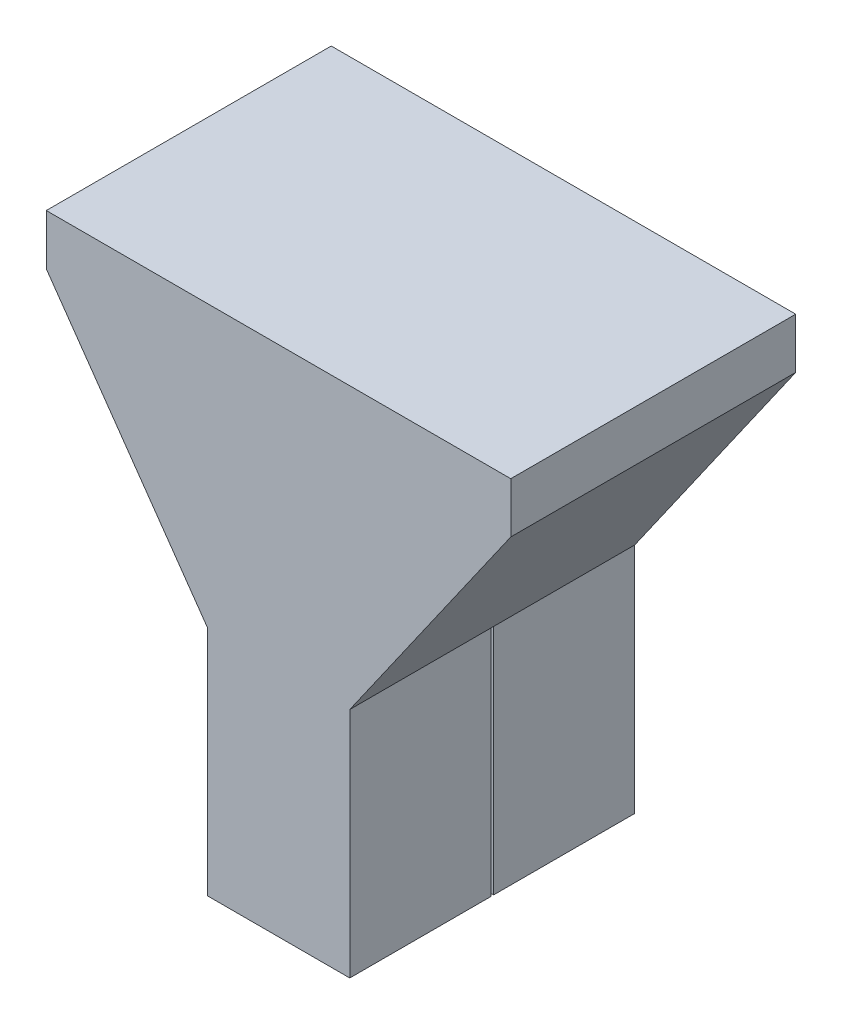
ISO-10303-21;
HEADER;
FILE_DESCRIPTION(('STEP AP214'),'2;1');
FILE_NAME('part.step','',(''),(''),'','','');
FILE_SCHEMA(('AUTOMOTIVE_DESIGN { 1 0 10303 214 1 1 1 1 }'));
ENDSEC;
DATA;
#1=APPLICATION_CONTEXT('core data for automotive mechanical design processes');
#2=APPLICATION_PROTOCOL_DEFINITION('international standard','automotive_design',2000,#1);
#3=PRODUCT_CONTEXT('',#1,'mechanical');
#4=PRODUCT('Part','Part','',(#3));
#5=PRODUCT_RELATED_PRODUCT_CATEGORY('part','',(#4));
#6=PRODUCT_DEFINITION_FORMATION('','',#4);
#7=PRODUCT_DEFINITION_CONTEXT('part definition',#1,'design');
#8=PRODUCT_DEFINITION('design','',#6,#7);
#9=PRODUCT_DEFINITION_SHAPE('','',#8);
#10=(LENGTH_UNIT() NAMED_UNIT(*) SI_UNIT(.MILLI.,.METRE.));
#11=(NAMED_UNIT(*) PLANE_ANGLE_UNIT() SI_UNIT($,.RADIAN.));
#12=(NAMED_UNIT(*) SI_UNIT($,.STERADIAN.) SOLID_ANGLE_UNIT());
#13=UNCERTAINTY_MEASURE_WITH_UNIT(LENGTH_MEASURE(1.E-05),#10,'distance_accuracy_value','');
#14=(GEOMETRIC_REPRESENTATION_CONTEXT(3) GLOBAL_UNCERTAINTY_ASSIGNED_CONTEXT((#13)) GLOBAL_UNIT_ASSIGNED_CONTEXT((#10,
#11,#12)) REPRESENTATION_CONTEXT('',''));
#15=CARTESIAN_POINT('',(0.,0.,0.));
#16=DIRECTION('',(0.,0.,1.));
#17=DIRECTION('',(1.,0.,0.));
#18=AXIS2_PLACEMENT_3D('',#15,#16,#17);
#19=CARTESIAN_POINT('',(0.,250.,-25.));
#20=DIRECTION('',(0.,0.,-1.));
#21=DIRECTION('',(-1.,0.,0.));
#22=AXIS2_PLACEMENT_3D('',#19,#20,#21);
#23=PLANE('',#22);
#24=CARTESIAN_POINT('',(0.,250.,-25.));
#25=DIRECTION('',(0.,0.,-1.));
#26=DIRECTION('',(-1.,0.,0.));
#27=AXIS2_PLACEMENT_3D('',#24,#25,#26);
#28=CIRCLE('',#27,25.);
#29=CARTESIAN_POINT('',(-25.,250.,-25.));
#30=VERTEX_POINT('',#29);
#31=EDGE_CURVE('E173',#30,#30,#28,.T.);
#32=ORIENTED_EDGE('',*,*,#31,.T.);
#33=EDGE_LOOP('',(#32));
#34=FACE_BOUND('',#33,.T.);
#35=DIRECTION('',(1.,0.,0.));
#36=VECTOR('',#35,1.);
#37=CARTESIAN_POINT('',(17.5,267.5,-25.));
#38=LINE('',#37,#36);
#39=CARTESIAN_POINT('',(-17.5,267.5,-25.));
#40=VERTEX_POINT('',#39);
#41=CARTESIAN_POINT('',(17.5,267.5,-25.));
#42=VERTEX_POINT('',#41);
#43=EDGE_CURVE('E277',#40,#42,#38,.T.);
#44=ORIENTED_EDGE('',*,*,#43,.F.);
#45=DIRECTION('',(0.,1.,0.));
#46=VECTOR('',#45,1.);
#47=CARTESIAN_POINT('',(-17.5,232.5,-25.));
#48=LINE('',#47,#46);
#49=CARTESIAN_POINT('',(-17.5,232.5,-25.));
#50=VERTEX_POINT('',#49);
#51=EDGE_CURVE('E171',#50,#40,#48,.T.);
#52=ORIENTED_EDGE('',*,*,#51,.F.);
#53=DIRECTION('',(-1.,0.,0.));
#54=VECTOR('',#53,1.);
#55=CARTESIAN_POINT('',(17.5,232.5,-25.));
#56=LINE('',#55,#54);
#57=CARTESIAN_POINT('',(17.5,232.5,-25.));
#58=VERTEX_POINT('',#57);
#59=EDGE_CURVE('E167',#58,#50,#56,.T.);
#60=ORIENTED_EDGE('',*,*,#59,.F.);
#61=DIRECTION('',(0.,-1.,0.));
#62=VECTOR('',#61,1.);
#63=CARTESIAN_POINT('',(17.5,232.5,-25.));
#64=LINE('',#63,#62);
#65=EDGE_CURVE('E279',#42,#58,#64,.T.);
#66=ORIENTED_EDGE('',*,*,#65,.F.);
#67=EDGE_LOOP('',(#44,#52,#60,#66));
#68=FACE_BOUND('',#67,.T.);
#69=ADVANCED_FACE('F33',(#34,#68),#23,.T.);
#70=CARTESIAN_POINT('',(125.,0.,500.));
#71=DIRECTION('',(-1.,0.,0.));
#72=DIRECTION('',(0.,0.,1.));
#73=AXIS2_PLACEMENT_3D('',#70,#71,#72);
#74=PLANE('',#73);
#75=DIRECTION('',(0.,-1.,0.));
#76=VECTOR('',#75,1.);
#77=CARTESIAN_POINT('',(125.,408.,252.5));
#78=LINE('',#77,#76);
#79=CARTESIAN_POINT('',(125.,408.,252.5));
#80=VERTEX_POINT('',#79);
#81=CARTESIAN_POINT('',(125.,0.,252.5));
#82=VERTEX_POINT('',#81);
#83=EDGE_CURVE('E176',#80,#82,#78,.T.);
#84=ORIENTED_EDGE('',*,*,#83,.F.);
#85=DIRECTION('',(0.,0.,-1.));
#86=VECTOR('',#85,1.);
#87=CARTESIAN_POINT('',(125.,408.,500.));
#88=LINE('',#87,#86);
#89=CARTESIAN_POINT('',(125.,408.,500.));
#90=VERTEX_POINT('',#89);
#91=EDGE_CURVE('E560',#90,#80,#88,.T.);
#92=ORIENTED_EDGE('',*,*,#91,.F.);
#93=DIRECTION('',(0.,1.,0.));
#94=VECTOR('',#93,1.);
#95=CARTESIAN_POINT('',(125.,0.,500.));
#96=LINE('',#95,#94);
#97=CARTESIAN_POINT('',(125.,0.,500.));
#98=VERTEX_POINT('',#97);
#99=EDGE_CURVE('E539',#98,#90,#96,.T.);
#100=ORIENTED_EDGE('',*,*,#99,.F.);
#101=DIRECTION('',(0.,0.,-1.));
#102=VECTOR('',#101,1.);
#103=CARTESIAN_POINT('',(125.,0.,500.));
#104=LINE('',#103,#102);
#105=EDGE_CURVE('E37',#98,#82,#104,.T.);
#106=ORIENTED_EDGE('',*,*,#105,.T.);
#107=EDGE_LOOP('',(#84,#92,#100,#106));
#108=FACE_BOUND('',#107,.T.);
#109=ADVANCED_FACE('F262',(#108),#74,.F.);
#110=CARTESIAN_POINT('',(0.,0.,500.));
#111=DIRECTION('',(0.,1.,0.));
#112=DIRECTION('',(0.,0.,1.));
#113=AXIS2_PLACEMENT_3D('',#110,#111,#112);
#114=PLANE('',#113);
#115=CARTESIAN_POINT('',(0.,0.,375.));
#116=DIRECTION('',(0.,-1.,0.));
#117=DIRECTION('',(0.,0.,-1.));
#118=AXIS2_PLACEMENT_3D('',#115,#116,#117);
#119=CIRCLE('',#118,15.);
#120=CARTESIAN_POINT('',(0.,0.,360.));
#121=VERTEX_POINT('',#120);
#122=EDGE_CURVE('E605',#121,#121,#119,.T.);
#123=ORIENTED_EDGE('',*,*,#122,.F.);
#124=EDGE_LOOP('',(#123));
#125=FACE_BOUND('',#124,.T.);
#126=CARTESIAN_POINT('',(0.,0.,125.));
#127=DIRECTION('',(0.,-1.,0.));
#128=DIRECTION('',(0.,0.,-1.));
#129=AXIS2_PLACEMENT_3D('',#126,#127,#128);
#130=CIRCLE('',#129,15.);
#131=CARTESIAN_POINT('',(0.,0.,110.));
#132=VERTEX_POINT('',#131);
#133=EDGE_CURVE('E530',#132,#132,#130,.T.);
#134=ORIENTED_EDGE('',*,*,#133,.F.);
#135=EDGE_LOOP('',(#134));
#136=FACE_BOUND('',#135,.T.);
#137=CARTESIAN_POINT('',(125.,0.,247.5));
#138=VERTEX_POINT('',#137);
#139=CARTESIAN_POINT('',(125.,0.,0.));
#140=VERTEX_POINT('',#139);
#141=EDGE_CURVE('E562',#138,#140,#104,.T.);
#142=ORIENTED_EDGE('',*,*,#141,.F.);
#143=DIRECTION('',(-1.,0.,0.));
#144=VECTOR('',#143,1.);
#145=CARTESIAN_POINT('',(125.,0.,247.5));
#146=LINE('',#145,#144);
#147=CARTESIAN_POINT('',(-95.,0.,247.5));
#148=VERTEX_POINT('',#147);
#149=EDGE_CURVE('E592',#138,#148,#146,.T.);
#150=ORIENTED_EDGE('',*,*,#149,.T.);
#151=DIRECTION('',(0.,0.,1.));
#152=VECTOR('',#151,1.);
#153=CARTESIAN_POINT('',(-95.,0.,247.5));
#154=LINE('',#153,#152);
#155=CARTESIAN_POINT('',(-95.,0.,252.5));
#156=VERTEX_POINT('',#155);
#157=EDGE_CURVE('E602',#148,#156,#154,.T.);
#158=ORIENTED_EDGE('',*,*,#157,.T.);
#159=DIRECTION('',(-1.,0.,0.));
#160=VECTOR('',#159,1.);
#161=CARTESIAN_POINT('',(125.,0.,252.5));
#162=LINE('',#161,#160);
#163=EDGE_CURVE('E583',#82,#156,#162,.T.);
#164=ORIENTED_EDGE('',*,*,#163,.F.);
#165=ORIENTED_EDGE('',*,*,#105,.F.);
#166=DIRECTION('',(1.,0.,0.));
#167=VECTOR('',#166,1.);
#168=CARTESIAN_POINT('',(0.,0.,500.));
#169=LINE('',#168,#167);
#170=CARTESIAN_POINT('',(-125.,0.,500.));
#171=VERTEX_POINT('',#170);
#172=EDGE_CURVE('E507',#171,#98,#169,.T.);
#173=ORIENTED_EDGE('',*,*,#172,.F.);
#174=DIRECTION('',(0.,0.,-1.));
#175=VECTOR('',#174,1.);
#176=CARTESIAN_POINT('',(-125.,0.,500.));
#177=LINE('',#176,#175);
#178=CARTESIAN_POINT('',(-125.,0.,0.));
#179=VERTEX_POINT('',#178);
#180=EDGE_CURVE('E504',#171,#179,#177,.T.);
#181=ORIENTED_EDGE('',*,*,#180,.T.);
#182=DIRECTION('',(1.,0.,0.));
#183=VECTOR('',#182,1.);
#184=CARTESIAN_POINT('',(0.,0.,0.));
#185=LINE('',#184,#183);
#186=EDGE_CURVE('E491',#179,#140,#185,.T.);
#187=ORIENTED_EDGE('',*,*,#186,.T.);
#188=EDGE_LOOP('',(#142,#150,#158,#164,#165,#173,#181,#187));
#189=FACE_BOUND('',#188,.T.);
#190=ADVANCED_FACE('F35',(#125,#136,#189),#114,.F.);
#191=CARTESIAN_POINT('',(125.,408.,247.5));
#192=VERTEX_POINT('',#191);
#193=CARTESIAN_POINT('',(125.,408.,0.));
#194=VERTEX_POINT('',#193);
#195=EDGE_CURVE('E559',#192,#194,#88,.T.);
#196=ORIENTED_EDGE('',*,*,#195,.F.);
#197=DIRECTION('',(0.,-1.,0.));
#198=VECTOR('',#197,1.);
#199=CARTESIAN_POINT('',(125.,408.,247.5));
#200=LINE('',#199,#198);
#201=EDGE_CURVE('E57',#192,#138,#200,.T.);
#202=ORIENTED_EDGE('',*,*,#201,.T.);
#203=ORIENTED_EDGE('',*,*,#141,.T.);
#204=DIRECTION('',(0.,1.,0.));
#205=VECTOR('',#204,1.);
#206=CARTESIAN_POINT('',(125.,0.,0.));
#207=LINE('',#206,#205);
#208=EDGE_CURVE('E498',#140,#194,#207,.T.);
#209=ORIENTED_EDGE('',*,*,#208,.T.);
#210=EDGE_LOOP('',(#196,#202,#203,#209));
#211=FACE_BOUND('',#210,.T.);
#212=ADVANCED_FACE('F258',(#211),#74,.F.);
#213=CARTESIAN_POINT('',(125.,408.,500.));
#214=DIRECTION('',(-0.819152044288993,0.573576436351044,0.));
#215=DIRECTION('',(-0.573576436351044,-0.819152044288993,0.));
#216=AXIS2_PLACEMENT_3D('',#213,#214,#215);
#217=PLANE('',#216);
#218=DIRECTION('',(0.573576436351044,0.819152044288993,0.));
#219=VECTOR('',#218,1.);
#220=CARTESIAN_POINT('',(125.,408.,0.));
#221=LINE('',#220,#219);
#222=CARTESIAN_POINT('',(407.5,811.45181190465,0.));
#223=VERTEX_POINT('',#222);
#224=EDGE_CURVE('E550',#194,#223,#221,.T.);
#225=ORIENTED_EDGE('',*,*,#224,.T.);
#226=DIRECTION('',(0.,0.,-1.));
#227=VECTOR('',#226,1.);
#228=CARTESIAN_POINT('',(407.5,811.45181190465,500.));
#229=LINE('',#228,#227);
#230=CARTESIAN_POINT('',(407.5,811.45181190465,500.));
#231=VERTEX_POINT('',#230);
#232=EDGE_CURVE('E557',#231,#223,#229,.T.);
#233=ORIENTED_EDGE('',*,*,#232,.F.);
#234=DIRECTION('',(0.573576436351044,0.819152044288993,0.));
#235=VECTOR('',#234,1.);
#236=CARTESIAN_POINT('',(125.,408.,500.));
#237=LINE('',#236,#235);
#238=EDGE_CURVE('E542',#90,#231,#237,.T.);
#239=ORIENTED_EDGE('',*,*,#238,.F.);
#240=ORIENTED_EDGE('',*,*,#91,.T.);
#241=DIRECTION('',(0.,0.,1.));
#242=VECTOR('',#241,1.);
#243=CARTESIAN_POINT('',(125.,408.,247.5));
#244=LINE('',#243,#242);
#245=EDGE_CURVE('E567',#192,#80,#244,.T.);
#246=ORIENTED_EDGE('',*,*,#245,.F.);
#247=ORIENTED_EDGE('',*,*,#195,.T.);
#248=EDGE_LOOP('',(#225,#233,#239,#240,#246,#247));
#249=FACE_BOUND('',#248,.T.);
#250=ADVANCED_FACE('F255',(#249),#217,.F.);
#251=CARTESIAN_POINT('',(407.5,811.45181190465,500.));
#252=DIRECTION('',(-1.,0.,0.));
#253=DIRECTION('',(0.,0.,1.));
#254=AXIS2_PLACEMENT_3D('',#251,#252,#253);
#255=PLANE('',#254);
#256=DIRECTION('',(0.,1.,0.));
#257=VECTOR('',#256,1.);
#258=CARTESIAN_POINT('',(407.5,811.45181190465,0.));
#259=LINE('',#258,#257);
#260=CARTESIAN_POINT('',(407.5,900.,0.));
#261=VERTEX_POINT('',#260);
#262=EDGE_CURVE('E552',#223,#261,#259,.T.);
#263=ORIENTED_EDGE('',*,*,#262,.T.);
#264=DIRECTION('',(0.,0.,-1.));
#265=VECTOR('',#264,1.);
#266=CARTESIAN_POINT('',(407.5,900.,500.));
#267=LINE('',#266,#265);
#268=CARTESIAN_POINT('',(407.5,900.,500.));
#269=VERTEX_POINT('',#268);
#270=EDGE_CURVE('E547',#269,#261,#267,.T.);
#271=ORIENTED_EDGE('',*,*,#270,.F.);
#272=DIRECTION('',(0.,1.,0.));
#273=VECTOR('',#272,1.);
#274=CARTESIAN_POINT('',(407.5,811.45181190465,500.));
#275=LINE('',#274,#273);
#276=EDGE_CURVE('E544',#231,#269,#275,.T.);
#277=ORIENTED_EDGE('',*,*,#276,.F.);
#278=ORIENTED_EDGE('',*,*,#232,.T.);
#279=EDGE_LOOP('',(#263,#271,#277,#278));
#280=FACE_BOUND('',#279,.T.);
#281=ADVANCED_FACE('F251',(#280),#255,.F.);
#282=CARTESIAN_POINT('',(407.5,900.,500.));
#283=DIRECTION('',(0.,-1.,0.));
#284=DIRECTION('',(1.,0.,0.));
#285=AXIS2_PLACEMENT_3D('',#282,#283,#284);
#286=PLANE('',#285);
#287=DIRECTION('',(-1.,0.,0.));
#288=VECTOR('',#287,1.);
#289=CARTESIAN_POINT('',(407.5,900.,0.));
#290=LINE('',#289,#288);
#291=CARTESIAN_POINT('',(-407.5,900.,0.));
#292=VERTEX_POINT('',#291);
#293=EDGE_CURVE('E540',#261,#292,#290,.T.);
#294=ORIENTED_EDGE('',*,*,#293,.T.);
#295=DIRECTION('',(0.,0.,-1.));
#296=VECTOR('',#295,1.);
#297=CARTESIAN_POINT('',(-407.5,900.,500.));
#298=LINE('',#297,#296);
#299=CARTESIAN_POINT('',(-407.5,900.,500.));
#300=VERTEX_POINT('',#299);
#301=EDGE_CURVE('E527',#300,#292,#298,.T.);
#302=ORIENTED_EDGE('',*,*,#301,.F.);
#303=DIRECTION('',(-1.,0.,0.));
#304=VECTOR('',#303,1.);
#305=CARTESIAN_POINT('',(407.5,900.,500.));
#306=LINE('',#305,#304);
#307=EDGE_CURVE('E546',#269,#300,#306,.T.);
#308=ORIENTED_EDGE('',*,*,#307,.F.);
#309=ORIENTED_EDGE('',*,*,#270,.T.);
#310=EDGE_LOOP('',(#294,#302,#308,#309));
#311=FACE_BOUND('',#310,.T.);
#312=ADVANCED_FACE('F244',(#311),#286,.F.);
#313=CARTESIAN_POINT('',(0.,0.,500.));
#314=DIRECTION('',(0.,0.,1.));
#315=DIRECTION('',(1.,0.,0.));
#316=AXIS2_PLACEMENT_3D('',#313,#314,#315);
#317=PLANE('',#316);
#318=ORIENTED_EDGE('',*,*,#172,.T.);
#319=ORIENTED_EDGE('',*,*,#99,.T.);
#320=ORIENTED_EDGE('',*,*,#238,.T.);
#321=ORIENTED_EDGE('',*,*,#276,.T.);
#322=ORIENTED_EDGE('',*,*,#307,.T.);
#323=DIRECTION('',(0.,1.,0.));
#324=VECTOR('',#323,1.);
#325=CARTESIAN_POINT('',(-407.5,811.45181190465,500.));
#326=LINE('',#325,#324);
#327=CARTESIAN_POINT('',(-407.5,811.45181190465,500.));
#328=VERTEX_POINT('',#327);
#329=EDGE_CURVE('E514',#328,#300,#326,.T.);
#330=ORIENTED_EDGE('',*,*,#329,.F.);
#331=DIRECTION('',(-0.573576436351044,0.819152044288993,0.));
#332=VECTOR('',#331,1.);
#333=CARTESIAN_POINT('',(-125.,408.,500.));
#334=LINE('',#333,#332);
#335=CARTESIAN_POINT('',(-125.,408.,500.));
#336=VERTEX_POINT('',#335);
#337=EDGE_CURVE('E518',#336,#328,#334,.T.);
#338=ORIENTED_EDGE('',*,*,#337,.F.);
#339=DIRECTION('',(0.,1.,0.));
#340=VECTOR('',#339,1.);
#341=CARTESIAN_POINT('',(-125.,0.,500.));
#342=LINE('',#341,#340);
#343=EDGE_CURVE('E511',#171,#336,#342,.T.);
#344=ORIENTED_EDGE('',*,*,#343,.F.);
#345=EDGE_LOOP('',(#318,#319,#320,#321,#322,#330,#338,#344));
#346=FACE_BOUND('',#345,.T.);
#347=ADVANCED_FACE('F241',(#346),#317,.T.);
#348=CARTESIAN_POINT('',(0.,0.,0.));
#349=DIRECTION('',(0.,0.,1.));
#350=DIRECTION('',(1.,0.,0.));
#351=AXIS2_PLACEMENT_3D('',#348,#349,#350);
#352=PLANE('',#351);
#353=CARTESIAN_POINT('',(0.,225.,0.));
#354=DIRECTION('',(0.,0.,-1.));
#355=DIRECTION('',(-1.,0.,0.));
#356=AXIS2_PLACEMENT_3D('',#353,#354,#355);
#357=CIRCLE('',#356,25.);
#358=CARTESIAN_POINT('',(-25.,225.,0.));
#359=VERTEX_POINT('',#358);
#360=EDGE_CURVE('E11',#359,#359,#357,.T.);
#361=ORIENTED_EDGE('',*,*,#360,.F.);
#362=EDGE_LOOP('',(#361));
#363=FACE_BOUND('',#362,.T.);
#364=ORIENTED_EDGE('',*,*,#186,.F.);
#365=DIRECTION('',(0.,1.,0.));
#366=VECTOR('',#365,1.);
#367=CARTESIAN_POINT('',(-125.,0.,0.));
#368=LINE('',#367,#366);
#369=CARTESIAN_POINT('',(-125.,408.,0.));
#370=VERTEX_POINT('',#369);
#371=EDGE_CURVE('E495',#179,#370,#368,.T.);
#372=ORIENTED_EDGE('',*,*,#371,.T.);
#373=DIRECTION('',(-0.573576436351044,0.819152044288993,0.));
#374=VECTOR('',#373,1.);
#375=CARTESIAN_POINT('',(-125.,408.,0.));
#376=LINE('',#375,#374);
#377=CARTESIAN_POINT('',(-407.5,811.45181190465,0.));
#378=VERTEX_POINT('',#377);
#379=EDGE_CURVE('E515',#370,#378,#376,.T.);
#380=ORIENTED_EDGE('',*,*,#379,.T.);
#381=DIRECTION('',(0.,1.,0.));
#382=VECTOR('',#381,1.);
#383=CARTESIAN_POINT('',(-407.5,811.45181190465,0.));
#384=LINE('',#383,#382);
#385=EDGE_CURVE('E520',#378,#292,#384,.T.);
#386=ORIENTED_EDGE('',*,*,#385,.T.);
#387=ORIENTED_EDGE('',*,*,#293,.F.);
#388=ORIENTED_EDGE('',*,*,#262,.F.);
#389=ORIENTED_EDGE('',*,*,#224,.F.);
#390=ORIENTED_EDGE('',*,*,#208,.F.);
#391=EDGE_LOOP('',(#364,#372,#380,#386,#387,#388,#389,#390));
#392=FACE_BOUND('',#391,.T.);
#393=ADVANCED_FACE('F239',(#363,#392),#352,.F.);
#394=CARTESIAN_POINT('',(0.,30.,125.));
#395=DIRECTION('',(0.,1.,0.));
#396=DIRECTION('',(0.,0.,1.));
#397=AXIS2_PLACEMENT_3D('',#394,#395,#396);
#398=PLANE('',#397);
#399=CARTESIAN_POINT('',(0.,30.,125.));
#400=DIRECTION('',(0.,-1.,0.));
#401=DIRECTION('',(0.,0.,-1.));
#402=AXIS2_PLACEMENT_3D('',#399,#400,#401);
#403=CIRCLE('',#402,10.);
#404=CARTESIAN_POINT('',(0.,30.,115.));
#405=VERTEX_POINT('',#404);
#406=EDGE_CURVE('E501',#405,#405,#403,.T.);
#407=ORIENTED_EDGE('',*,*,#406,.T.);
#408=EDGE_LOOP('',(#407));
#409=FACE_BOUND('',#408,.T.);
#410=ADVANCED_FACE('F235',(#409),#398,.F.);
#411=CARTESIAN_POINT('',(0.,20.,125.));
#412=DIRECTION('',(0.,-1.,0.));
#413=DIRECTION('',(0.,0.,-1.));
#414=AXIS2_PLACEMENT_3D('',#411,#412,#413);
#415=CONICAL_SURFACE('',#414,15.,0.463647609000807);
#416=CARTESIAN_POINT('',(0.,20.,125.));
#417=DIRECTION('',(0.,-1.,0.));
#418=DIRECTION('',(0.,0.,-1.));
#419=AXIS2_PLACEMENT_3D('',#416,#417,#418);
#420=CIRCLE('',#419,15.);
#421=CARTESIAN_POINT('',(0.,20.,110.));
#422=VERTEX_POINT('',#421);
#423=EDGE_CURVE('E533',#422,#422,#420,.T.);
#424=ORIENTED_EDGE('',*,*,#423,.T.);
#425=EDGE_LOOP('',(#424));
#426=FACE_BOUND('',#425,.T.);
#427=ORIENTED_EDGE('',*,*,#406,.F.);
#428=EDGE_LOOP('',(#427));
#429=FACE_BOUND('',#428,.T.);
#430=ADVANCED_FACE('F231',(#426,#429),#415,.F.);
#431=CARTESIAN_POINT('',(0.,0.,125.));
#432=DIRECTION('',(0.,-1.,0.));
#433=DIRECTION('',(0.,0.,-1.));
#434=AXIS2_PLACEMENT_3D('',#431,#432,#433);
#435=CYLINDRICAL_SURFACE('',#434,15.);
#436=ORIENTED_EDGE('',*,*,#133,.T.);
#437=EDGE_LOOP('',(#436));
#438=FACE_BOUND('',#437,.T.);
#439=ORIENTED_EDGE('',*,*,#423,.F.);
#440=EDGE_LOOP('',(#439));
#441=FACE_BOUND('',#440,.T.);
#442=ADVANCED_FACE('F227',(#438,#441),#435,.F.);
#443=CARTESIAN_POINT('',(-407.5,811.45181190465,500.));
#444=DIRECTION('',(-1.,0.,0.));
#445=DIRECTION('',(0.,0.,1.));
#446=AXIS2_PLACEMENT_3D('',#443,#444,#445);
#447=PLANE('',#446);
#448=ORIENTED_EDGE('',*,*,#385,.F.);
#449=DIRECTION('',(0.,0.,-1.));
#450=VECTOR('',#449,1.);
#451=CARTESIAN_POINT('',(-407.5,811.45181190465,500.));
#452=LINE('',#451,#450);
#453=EDGE_CURVE('E525',#328,#378,#452,.T.);
#454=ORIENTED_EDGE('',*,*,#453,.F.);
#455=ORIENTED_EDGE('',*,*,#329,.T.);
#456=ORIENTED_EDGE('',*,*,#301,.T.);
#457=EDGE_LOOP('',(#448,#454,#455,#456));
#458=FACE_BOUND('',#457,.T.);
#459=ADVANCED_FACE('F223',(#458),#447,.T.);
#460=CARTESIAN_POINT('',(-125.,408.,500.));
#461=DIRECTION('',(-0.819152044288993,-0.573576436351044,0.));
#462=DIRECTION('',(0.573576436351044,-0.819152044288993,0.));
#463=AXIS2_PLACEMENT_3D('',#460,#461,#462);
#464=PLANE('',#463);
#465=ORIENTED_EDGE('',*,*,#379,.F.);
#466=DIRECTION('',(0.,0.,-1.));
#467=VECTOR('',#466,1.);
#468=CARTESIAN_POINT('',(-125.,408.,500.));
#469=LINE('',#468,#467);
#470=EDGE_CURVE('E510',#336,#370,#469,.T.);
#471=ORIENTED_EDGE('',*,*,#470,.F.);
#472=ORIENTED_EDGE('',*,*,#337,.T.);
#473=ORIENTED_EDGE('',*,*,#453,.T.);
#474=EDGE_LOOP('',(#465,#471,#472,#473));
#475=FACE_BOUND('',#474,.T.);
#476=ADVANCED_FACE('F219',(#475),#464,.T.);
#477=CARTESIAN_POINT('',(-125.,0.,500.));
#478=DIRECTION('',(-1.,0.,0.));
#479=DIRECTION('',(0.,0.,1.));
#480=AXIS2_PLACEMENT_3D('',#477,#478,#479);
#481=PLANE('',#480);
#482=ORIENTED_EDGE('',*,*,#371,.F.);
#483=ORIENTED_EDGE('',*,*,#180,.F.);
#484=ORIENTED_EDGE('',*,*,#343,.T.);
#485=ORIENTED_EDGE('',*,*,#470,.T.);
#486=EDGE_LOOP('',(#482,#483,#484,#485));
#487=FACE_BOUND('',#486,.T.);
#488=ADVANCED_FACE('F215',(#487),#481,.T.);
#489=CARTESIAN_POINT('',(0.,30.,375.));
#490=DIRECTION('',(0.,1.,0.));
#491=DIRECTION('',(0.,0.,1.));
#492=AXIS2_PLACEMENT_3D('',#489,#490,#491);
#493=PLANE('',#492);
#494=CARTESIAN_POINT('',(0.,30.,375.));
#495=DIRECTION('',(0.,-1.,0.));
#496=DIRECTION('',(0.,0.,-1.));
#497=AXIS2_PLACEMENT_3D('',#494,#495,#496);
#498=CIRCLE('',#497,10.);
#499=CARTESIAN_POINT('',(0.,30.,365.));
#500=VERTEX_POINT('',#499);
#501=EDGE_CURVE('E611',#500,#500,#498,.T.);
#502=ORIENTED_EDGE('',*,*,#501,.T.);
#503=EDGE_LOOP('',(#502));
#504=FACE_BOUND('',#503,.T.);
#505=ADVANCED_FACE('F211',(#504),#493,.F.);
#506=CARTESIAN_POINT('',(0.,20.,375.));
#507=DIRECTION('',(0.,-1.,0.));
#508=DIRECTION('',(0.,0.,-1.));
#509=AXIS2_PLACEMENT_3D('',#506,#507,#508);
#510=CONICAL_SURFACE('',#509,15.,0.463647609000807);
#511=ORIENTED_EDGE('',*,*,#501,.F.);
#512=EDGE_LOOP('',(#511));
#513=FACE_BOUND('',#512,.T.);
#514=CARTESIAN_POINT('',(0.,20.,375.));
#515=DIRECTION('',(0.,-1.,0.));
#516=DIRECTION('',(0.,0.,-1.));
#517=AXIS2_PLACEMENT_3D('',#514,#515,#516);
#518=CIRCLE('',#517,15.);
#519=CARTESIAN_POINT('',(0.,20.,360.));
#520=VERTEX_POINT('',#519);
#521=EDGE_CURVE('E608',#520,#520,#518,.T.);
#522=ORIENTED_EDGE('',*,*,#521,.T.);
#523=EDGE_LOOP('',(#522));
#524=FACE_BOUND('',#523,.T.);
#525=ADVANCED_FACE('F207',(#513,#524),#510,.F.);
#526=CARTESIAN_POINT('',(0.,0.,375.));
#527=DIRECTION('',(0.,-1.,0.));
#528=DIRECTION('',(0.,0.,-1.));
#529=AXIS2_PLACEMENT_3D('',#526,#527,#528);
#530=CYLINDRICAL_SURFACE('',#529,15.);
#531=ORIENTED_EDGE('',*,*,#521,.F.);
#532=EDGE_LOOP('',(#531));
#533=FACE_BOUND('',#532,.T.);
#534=ORIENTED_EDGE('',*,*,#122,.T.);
#535=EDGE_LOOP('',(#534));
#536=FACE_BOUND('',#535,.T.);
#537=ADVANCED_FACE('F203',(#533,#536),#530,.F.);
#538=CARTESIAN_POINT('',(-95.,408.,247.5));
#539=DIRECTION('',(1.,0.,0.));
#540=DIRECTION('',(0.,1.,0.));
#541=AXIS2_PLACEMENT_3D('',#538,#539,#540);
#542=PLANE('',#541);
#543=ORIENTED_EDGE('',*,*,#157,.F.);
#544=DIRECTION('',(0.,1.,0.));
#545=VECTOR('',#544,1.);
#546=CARTESIAN_POINT('',(-95.,408.,247.5));
#547=LINE('',#546,#545);
#548=CARTESIAN_POINT('',(-95.,408.,247.5));
#549=VERTEX_POINT('',#548);
#550=EDGE_CURVE('E595',#148,#549,#547,.T.);
#551=ORIENTED_EDGE('',*,*,#550,.T.);
#552=DIRECTION('',(0.,0.,1.));
#553=VECTOR('',#552,1.);
#554=CARTESIAN_POINT('',(-95.,408.,247.5));
#555=LINE('',#554,#553);
#556=CARTESIAN_POINT('',(-95.,408.,252.5));
#557=VERTEX_POINT('',#556);
#558=EDGE_CURVE('E600',#549,#557,#555,.T.);
#559=ORIENTED_EDGE('',*,*,#558,.T.);
#560=DIRECTION('',(0.,1.,0.));
#561=VECTOR('',#560,1.);
#562=CARTESIAN_POINT('',(-95.,408.,252.5));
#563=LINE('',#562,#561);
#564=EDGE_CURVE('E584',#156,#557,#563,.T.);
#565=ORIENTED_EDGE('',*,*,#564,.F.);
#566=EDGE_LOOP('',(#543,#551,#559,#565));
#567=FACE_BOUND('',#566,.T.);
#568=ADVANCED_FACE('F199',(#567),#542,.T.);
#569=CARTESIAN_POINT('',(125.,408.,247.5));
#570=DIRECTION('',(0.,-1.,0.));
#571=DIRECTION('',(0.,0.,-1.));
#572=AXIS2_PLACEMENT_3D('',#569,#570,#571);
#573=PLANE('',#572);
#574=ORIENTED_EDGE('',*,*,#558,.F.);
#575=DIRECTION('',(1.,0.,0.));
#576=VECTOR('',#575,1.);
#577=CARTESIAN_POINT('',(125.,408.,247.5));
#578=LINE('',#577,#576);
#579=EDGE_CURVE('E597',#549,#192,#578,.T.);
#580=ORIENTED_EDGE('',*,*,#579,.T.);
#581=ORIENTED_EDGE('',*,*,#245,.T.);
#582=DIRECTION('',(1.,0.,0.));
#583=VECTOR('',#582,1.);
#584=CARTESIAN_POINT('',(125.,408.,252.5));
#585=LINE('',#584,#583);
#586=EDGE_CURVE('E589',#557,#80,#585,.T.);
#587=ORIENTED_EDGE('',*,*,#586,.F.);
#588=EDGE_LOOP('',(#574,#580,#581,#587));
#589=FACE_BOUND('',#588,.T.);
#590=ADVANCED_FACE('F196',(#589),#573,.T.);
#591=CARTESIAN_POINT('',(0.,0.,247.5));
#592=DIRECTION('',(0.,0.,-1.));
#593=DIRECTION('',(-1.,0.,0.));
#594=AXIS2_PLACEMENT_3D('',#591,#592,#593);
#595=PLANE('',#594);
#596=ORIENTED_EDGE('',*,*,#201,.F.);
#597=ORIENTED_EDGE('',*,*,#579,.F.);
#598=ORIENTED_EDGE('',*,*,#550,.F.);
#599=ORIENTED_EDGE('',*,*,#149,.F.);
#600=EDGE_LOOP('',(#596,#597,#598,#599));
#601=FACE_BOUND('',#600,.T.);
#602=ADVANCED_FACE('F192',(#601),#595,.F.);
#603=CARTESIAN_POINT('',(0.,0.,252.5));
#604=DIRECTION('',(0.,0.,-1.));
#605=DIRECTION('',(-1.,0.,0.));
#606=AXIS2_PLACEMENT_3D('',#603,#604,#605);
#607=PLANE('',#606);
#608=ORIENTED_EDGE('',*,*,#83,.T.);
#609=ORIENTED_EDGE('',*,*,#163,.T.);
#610=ORIENTED_EDGE('',*,*,#564,.T.);
#611=ORIENTED_EDGE('',*,*,#586,.T.);
#612=EDGE_LOOP('',(#608,#609,#610,#611));
#613=FACE_BOUND('',#612,.T.);
#614=ADVANCED_FACE('F187',(#613),#607,.T.);
#615=DIRECTION('',(0.,-0.707106781186544,0.707106781186551));
#616=VECTOR('',#615,1.);
#617=SURFACE_OF_LINEAR_EXTRUSION('',#28,#616);
#618=ORIENTED_EDGE('',*,*,#31,.F.);
#619=EDGE_LOOP('',(#618));
#620=FACE_BOUND('',#619,.T.);
#621=ORIENTED_EDGE('',*,*,#360,.T.);
#622=EDGE_LOOP('',(#621));
#623=FACE_BOUND('',#622,.T.);
#624=ADVANCED_FACE('F183',(#620,#623),#617,.F.);
#625=CARTESIAN_POINT('',(-17.5,232.5,-60.));
#626=DIRECTION('',(1.,0.,0.));
#627=DIRECTION('',(0.,0.,-1.));
#628=AXIS2_PLACEMENT_3D('',#625,#626,#627);
#629=PLANE('',#628);
#630=ORIENTED_EDGE('',*,*,#51,.T.);
#631=DIRECTION('',(0.,0.,1.));
#632=VECTOR('',#631,1.);
#633=CARTESIAN_POINT('',(-17.5,267.5,-60.));
#634=LINE('',#633,#632);
#635=CARTESIAN_POINT('',(-17.5,267.5,-60.));
#636=VERTEX_POINT('',#635);
#637=EDGE_CURVE('E152',#636,#40,#634,.T.);
#638=ORIENTED_EDGE('',*,*,#637,.F.);
#639=DIRECTION('',(0.,1.,0.));
#640=VECTOR('',#639,1.);
#641=CARTESIAN_POINT('',(-17.5,232.5,-60.));
#642=LINE('',#641,#640);
#643=CARTESIAN_POINT('',(-17.5,232.5,-60.));
#644=VERTEX_POINT('',#643);
#645=EDGE_CURVE('E159',#644,#636,#642,.T.);
#646=ORIENTED_EDGE('',*,*,#645,.F.);
#647=DIRECTION('',(0.,0.,1.));
#648=VECTOR('',#647,1.);
#649=CARTESIAN_POINT('',(-17.5,232.5,-60.));
#650=LINE('',#649,#648);
#651=EDGE_CURVE('E286',#644,#50,#650,.T.);
#652=ORIENTED_EDGE('',*,*,#651,.T.);
#653=EDGE_LOOP('',(#630,#638,#646,#652));
#654=FACE_BOUND('',#653,.T.);
#655=ADVANCED_FACE('F169',(#654),#629,.F.);
#656=CARTESIAN_POINT('',(17.5,267.5,-60.));
#657=DIRECTION('',(0.,-1.,0.));
#658=DIRECTION('',(0.,0.,-1.));
#659=AXIS2_PLACEMENT_3D('',#656,#657,#658);
#660=PLANE('',#659);
#661=ORIENTED_EDGE('',*,*,#43,.T.);
#662=DIRECTION('',(0.,0.,1.));
#663=VECTOR('',#662,1.);
#664=CARTESIAN_POINT('',(17.5,267.5,-60.));
#665=LINE('',#664,#663);
#666=CARTESIAN_POINT('',(17.5,267.5,-60.));
#667=VERTEX_POINT('',#666);
#668=EDGE_CURVE('E155',#667,#42,#665,.T.);
#669=ORIENTED_EDGE('',*,*,#668,.F.);
#670=DIRECTION('',(1.,0.,0.));
#671=VECTOR('',#670,1.);
#672=CARTESIAN_POINT('',(17.5,267.5,-60.));
#673=LINE('',#672,#671);
#674=EDGE_CURVE('E148',#636,#667,#673,.T.);
#675=ORIENTED_EDGE('',*,*,#674,.F.);
#676=ORIENTED_EDGE('',*,*,#637,.T.);
#677=EDGE_LOOP('',(#661,#669,#675,#676));
#678=FACE_BOUND('',#677,.T.);
#679=ADVANCED_FACE('F150',(#678),#660,.F.);
#680=CARTESIAN_POINT('',(17.5,232.5,-60.));
#681=DIRECTION('',(-1.,0.,0.));
#682=DIRECTION('',(0.,0.,1.));
#683=AXIS2_PLACEMENT_3D('',#680,#681,#682);
#684=PLANE('',#683);
#685=ORIENTED_EDGE('',*,*,#65,.T.);
#686=DIRECTION('',(0.,0.,1.));
#687=VECTOR('',#686,1.);
#688=CARTESIAN_POINT('',(17.5,232.5,-60.));
#689=LINE('',#688,#687);
#690=CARTESIAN_POINT('',(17.5,232.5,-60.));
#691=VERTEX_POINT('',#690);
#692=EDGE_CURVE('E49',#691,#58,#689,.T.);
#693=ORIENTED_EDGE('',*,*,#692,.F.);
#694=DIRECTION('',(0.,-1.,0.));
#695=VECTOR('',#694,1.);
#696=CARTESIAN_POINT('',(17.5,232.5,-60.));
#697=LINE('',#696,#695);
#698=EDGE_CURVE('E158',#667,#691,#697,.T.);
#699=ORIENTED_EDGE('',*,*,#698,.F.);
#700=ORIENTED_EDGE('',*,*,#668,.T.);
#701=EDGE_LOOP('',(#685,#693,#699,#700));
#702=FACE_BOUND('',#701,.T.);
#703=ADVANCED_FACE('F289',(#702),#684,.F.);
#704=CARTESIAN_POINT('',(17.5,232.5,-60.));
#705=DIRECTION('',(0.,1.,0.));
#706=DIRECTION('',(0.,0.,1.));
#707=AXIS2_PLACEMENT_3D('',#704,#705,#706);
#708=PLANE('',#707);
#709=ORIENTED_EDGE('',*,*,#59,.T.);
#710=ORIENTED_EDGE('',*,*,#651,.F.);
#711=DIRECTION('',(-1.,0.,0.));
#712=VECTOR('',#711,1.);
#713=CARTESIAN_POINT('',(17.5,232.5,-60.));
#714=LINE('',#713,#712);
#715=EDGE_CURVE('E163',#691,#644,#714,.T.);
#716=ORIENTED_EDGE('',*,*,#715,.F.);
#717=ORIENTED_EDGE('',*,*,#692,.T.);
#718=EDGE_LOOP('',(#709,#710,#716,#717));
#719=FACE_BOUND('',#718,.T.);
#720=ADVANCED_FACE('F290',(#719),#708,.F.);
#721=CARTESIAN_POINT('',(0.,0.,-60.));
#722=DIRECTION('',(0.,0.,1.));
#723=DIRECTION('',(1.,0.,0.));
#724=AXIS2_PLACEMENT_3D('',#721,#722,#723);
#725=PLANE('',#724);
#726=ORIENTED_EDGE('',*,*,#645,.T.);
#727=ORIENTED_EDGE('',*,*,#674,.T.);
#728=ORIENTED_EDGE('',*,*,#698,.T.);
#729=ORIENTED_EDGE('',*,*,#715,.T.);
#730=EDGE_LOOP('',(#726,#727,#728,#729));
#731=FACE_BOUND('',#730,.T.);
#732=ADVANCED_FACE('F162',(#731),#725,.F.);
#733=CLOSED_SHELL('',(#69,#109,#190,#212,#250,#281,#312,#347,#393,#410,#430,#442,#459,#476,#488,
#505,#525,#537,#568,#590,#602,#614,#624,#655,#679,#703,#720,#732));
#734=MANIFOLD_SOLID_BREP('B2',#733);
#735=ADVANCED_BREP_SHAPE_REPRESENTATION('',(#18,#734),#14);
#736=SHAPE_DEFINITION_REPRESENTATION(#9,#735);
ENDSEC;
END-ISO-10303-21;
